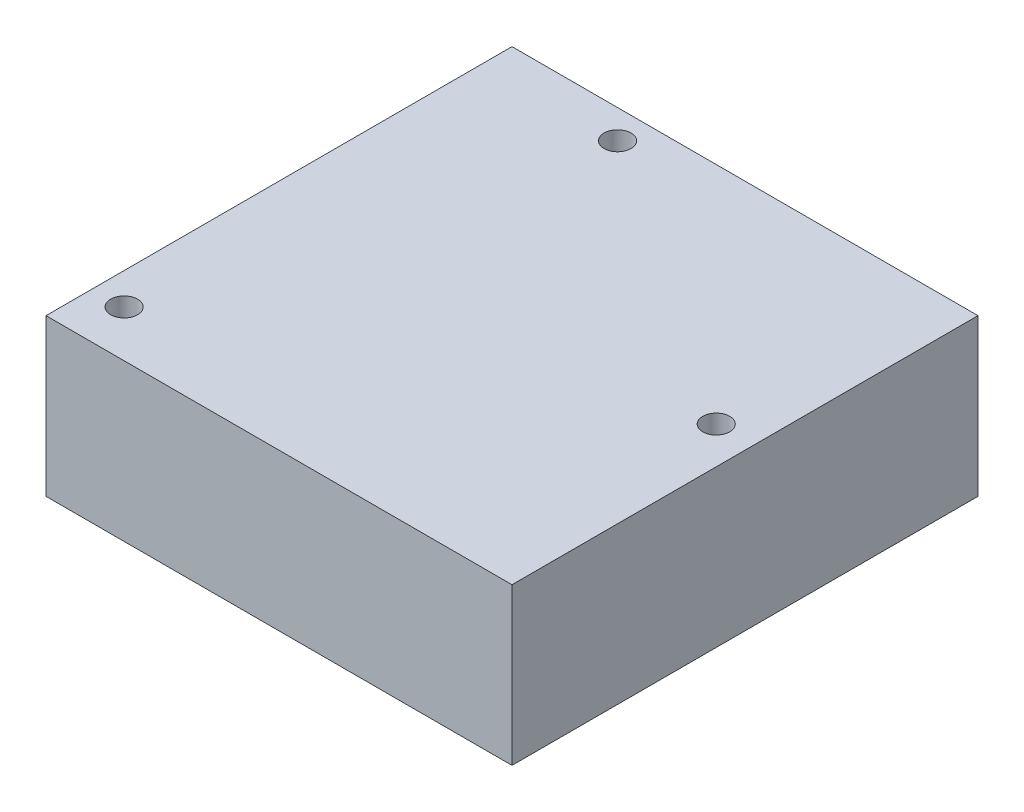
ISO-10303-21;
HEADER;
FILE_DESCRIPTION(('STEP AP214'),'2;1');
FILE_NAME('part.step','',(''),(''),'','','');
FILE_SCHEMA(('AUTOMOTIVE_DESIGN { 1 0 10303 214 1 1 1 1 }'));
ENDSEC;
DATA;
#1=APPLICATION_CONTEXT('core data for automotive mechanical design processes');
#2=APPLICATION_PROTOCOL_DEFINITION('international standard','automotive_design',2000,#1);
#3=PRODUCT_CONTEXT('',#1,'mechanical');
#4=PRODUCT('Part','Part','',(#3));
#5=PRODUCT_RELATED_PRODUCT_CATEGORY('part','',(#4));
#6=PRODUCT_DEFINITION_FORMATION('','',#4);
#7=PRODUCT_DEFINITION_CONTEXT('part definition',#1,'design');
#8=PRODUCT_DEFINITION('design','',#6,#7);
#9=PRODUCT_DEFINITION_SHAPE('','',#8);
#10=(LENGTH_UNIT() NAMED_UNIT(*) SI_UNIT(.MILLI.,.METRE.));
#11=(NAMED_UNIT(*) PLANE_ANGLE_UNIT() SI_UNIT($,.RADIAN.));
#12=(NAMED_UNIT(*) SI_UNIT($,.STERADIAN.) SOLID_ANGLE_UNIT());
#13=UNCERTAINTY_MEASURE_WITH_UNIT(LENGTH_MEASURE(1.E-05),#10,'distance_accuracy_value','');
#14=(GEOMETRIC_REPRESENTATION_CONTEXT(3) GLOBAL_UNCERTAINTY_ASSIGNED_CONTEXT((#13)) GLOBAL_UNIT_ASSIGNED_CONTEXT((#10,
#11,#12)) REPRESENTATION_CONTEXT('',''));
#15=CARTESIAN_POINT('',(0.,0.,0.));
#16=DIRECTION('',(0.,0.,1.));
#17=DIRECTION('',(1.,0.,0.));
#18=AXIS2_PLACEMENT_3D('',#15,#16,#17);
#19=CARTESIAN_POINT('',(21.59,15.,-21.59));
#20=DIRECTION('',(0.,0.,1.));
#21=DIRECTION('',(1.,0.,0.));
#22=AXIS2_PLACEMENT_3D('',#19,#20,#21);
#23=PLANE('',#22);
#24=DIRECTION('',(0.,-1.,0.));
#25=VECTOR('',#24,1.);
#26=CARTESIAN_POINT('',(21.59,15.,-21.59));
#27=LINE('',#26,#25);
#28=CARTESIAN_POINT('',(21.59,15.,-21.59));
#29=VERTEX_POINT('',#28);
#30=CARTESIAN_POINT('',(21.59,0.5,-21.59));
#31=VERTEX_POINT('',#30);
#32=EDGE_CURVE('E162',#29,#31,#27,.T.);
#33=ORIENTED_EDGE('',*,*,#32,.T.);
#34=DIRECTION('',(-1.,0.,0.));
#35=VECTOR('',#34,1.);
#36=CARTESIAN_POINT('',(21.59,0.5,-21.59));
#37=LINE('',#36,#35);
#38=CARTESIAN_POINT('',(-21.59,0.5,-21.59));
#39=VERTEX_POINT('',#38);
#40=EDGE_CURVE('E11',#31,#39,#37,.T.);
#41=ORIENTED_EDGE('',*,*,#40,.T.);
#42=DIRECTION('',(0.,-1.,0.));
#43=VECTOR('',#42,1.);
#44=CARTESIAN_POINT('',(-21.59,15.,-21.59));
#45=LINE('',#44,#43);
#46=CARTESIAN_POINT('',(-21.59,15.,-21.59));
#47=VERTEX_POINT('',#46);
#48=EDGE_CURVE('E91',#47,#39,#45,.T.);
#49=ORIENTED_EDGE('',*,*,#48,.F.);
#50=DIRECTION('',(-1.,0.,0.));
#51=VECTOR('',#50,1.);
#52=CARTESIAN_POINT('',(21.59,15.,-21.59));
#53=LINE('',#52,#51);
#54=EDGE_CURVE('E99',#29,#47,#53,.T.);
#55=ORIENTED_EDGE('',*,*,#54,.F.);
#56=EDGE_LOOP('',(#33,#41,#49,#55));
#57=FACE_BOUND('',#56,.T.);
#58=ADVANCED_FACE('F35',(#57),#23,.F.);
#59=CARTESIAN_POINT('',(-21.59,15.,-21.59));
#60=DIRECTION('',(1.,0.,0.));
#61=DIRECTION('',(0.,0.,-1.));
#62=AXIS2_PLACEMENT_3D('',#59,#60,#61);
#63=PLANE('',#62);
#64=ORIENTED_EDGE('',*,*,#48,.T.);
#65=DIRECTION('',(0.,0.,1.));
#66=VECTOR('',#65,1.);
#67=CARTESIAN_POINT('',(-21.59,0.5,-21.59));
#68=LINE('',#67,#66);
#69=CARTESIAN_POINT('',(-21.59,0.5,21.59));
#70=VERTEX_POINT('',#69);
#71=EDGE_CURVE('E125',#39,#70,#68,.T.);
#72=ORIENTED_EDGE('',*,*,#71,.T.);
#73=DIRECTION('',(0.,-1.,0.));
#74=VECTOR('',#73,1.);
#75=CARTESIAN_POINT('',(-21.59,15.,21.59));
#76=LINE('',#75,#74);
#77=CARTESIAN_POINT('',(-21.59,15.,21.59));
#78=VERTEX_POINT('',#77);
#79=EDGE_CURVE('E94',#78,#70,#76,.T.);
#80=ORIENTED_EDGE('',*,*,#79,.F.);
#81=DIRECTION('',(0.,0.,1.));
#82=VECTOR('',#81,1.);
#83=CARTESIAN_POINT('',(-21.59,15.,-21.59));
#84=LINE('',#83,#82);
#85=EDGE_CURVE('E88',#47,#78,#84,.T.);
#86=ORIENTED_EDGE('',*,*,#85,.F.);
#87=EDGE_LOOP('',(#64,#72,#80,#86));
#88=FACE_BOUND('',#87,.T.);
#89=ADVANCED_FACE('F90',(#88),#63,.F.);
#90=CARTESIAN_POINT('',(21.59,15.,21.59));
#91=DIRECTION('',(0.,0.,1.));
#92=DIRECTION('',(1.,0.,0.));
#93=AXIS2_PLACEMENT_3D('',#90,#91,#92);
#94=PLANE('',#93);
#95=ORIENTED_EDGE('',*,*,#79,.T.);
#96=DIRECTION('',(1.,0.,0.));
#97=VECTOR('',#96,1.);
#98=CARTESIAN_POINT('',(21.59,0.5,21.59));
#99=LINE('',#98,#97);
#100=CARTESIAN_POINT('',(21.59,0.5,21.59));
#101=VERTEX_POINT('',#100);
#102=EDGE_CURVE('E122',#70,#101,#99,.T.);
#103=ORIENTED_EDGE('',*,*,#102,.T.);
#104=DIRECTION('',(0.,-1.,0.));
#105=VECTOR('',#104,1.);
#106=CARTESIAN_POINT('',(21.59,15.,21.59));
#107=LINE('',#106,#105);
#108=CARTESIAN_POINT('',(21.59,15.,21.59));
#109=VERTEX_POINT('',#108);
#110=EDGE_CURVE('E112',#109,#101,#107,.T.);
#111=ORIENTED_EDGE('',*,*,#110,.F.);
#112=DIRECTION('',(-1.,0.,0.));
#113=VECTOR('',#112,1.);
#114=CARTESIAN_POINT('',(21.59,15.,21.59));
#115=LINE('',#114,#113);
#116=EDGE_CURVE('E98',#109,#78,#115,.T.);
#117=ORIENTED_EDGE('',*,*,#116,.T.);
#118=EDGE_LOOP('',(#95,#103,#111,#117));
#119=FACE_BOUND('',#118,.T.);
#120=ADVANCED_FACE('F165',(#119),#94,.T.);
#121=CARTESIAN_POINT('',(21.59,15.,-21.59));
#122=DIRECTION('',(1.,0.,0.));
#123=DIRECTION('',(0.,0.,-1.));
#124=AXIS2_PLACEMENT_3D('',#121,#122,#123);
#125=PLANE('',#124);
#126=ORIENTED_EDGE('',*,*,#110,.T.);
#127=DIRECTION('',(0.,0.,-1.));
#128=VECTOR('',#127,1.);
#129=CARTESIAN_POINT('',(21.59,0.5,-21.59));
#130=LINE('',#129,#128);
#131=EDGE_CURVE('E44',#101,#31,#130,.T.);
#132=ORIENTED_EDGE('',*,*,#131,.T.);
#133=ORIENTED_EDGE('',*,*,#32,.F.);
#134=DIRECTION('',(0.,0.,1.));
#135=VECTOR('',#134,1.);
#136=CARTESIAN_POINT('',(21.59,15.,-21.59));
#137=LINE('',#136,#135);
#138=EDGE_CURVE('E105',#29,#109,#137,.T.);
#139=ORIENTED_EDGE('',*,*,#138,.T.);
#140=EDGE_LOOP('',(#126,#132,#133,#139));
#141=FACE_BOUND('',#140,.T.);
#142=ADVANCED_FACE('F163',(#141),#125,.T.);
#143=CARTESIAN_POINT('',(0.,15.,0.));
#144=DIRECTION('',(0.,1.,0.));
#145=DIRECTION('',(0.,0.,1.));
#146=AXIS2_PLACEMENT_3D('',#143,#144,#145);
#147=PLANE('',#146);
#148=CARTESIAN_POINT('',(-18.669,15.,17.272));
#149=DIRECTION('',(0.,1.,0.));
#150=DIRECTION('',(0.,0.,1.));
#151=AXIS2_PLACEMENT_3D('',#148,#149,#150);
#152=CIRCLE('',#151,1.25);
#153=CARTESIAN_POINT('',(-18.669,15.,18.522));
#154=VERTEX_POINT('',#153);
#155=EDGE_CURVE('E137',#154,#154,#152,.T.);
#156=ORIENTED_EDGE('',*,*,#155,.F.);
#157=EDGE_LOOP('',(#156));
#158=FACE_BOUND('',#157,.T.);
#159=CARTESIAN_POINT('',(-9.144,15.,-18.923));
#160=DIRECTION('',(0.,1.,0.));
#161=DIRECTION('',(0.,0.,1.));
#162=AXIS2_PLACEMENT_3D('',#159,#160,#161);
#163=CIRCLE('',#162,1.25);
#164=CARTESIAN_POINT('',(-9.144,15.,-17.673));
#165=VERTEX_POINT('',#164);
#166=EDGE_CURVE('E147',#165,#165,#163,.T.);
#167=ORIENTED_EDGE('',*,*,#166,.F.);
#168=EDGE_LOOP('',(#167));
#169=FACE_BOUND('',#168,.T.);
#170=CARTESIAN_POINT('',(18.161,15.,-0.762000000000002));
#171=DIRECTION('',(0.,1.,0.));
#172=DIRECTION('',(0.,0.,1.));
#173=AXIS2_PLACEMENT_3D('',#170,#171,#172);
#174=CIRCLE('',#173,1.25);
#175=CARTESIAN_POINT('',(18.161,15.,0.487999999999995));
#176=VERTEX_POINT('',#175);
#177=EDGE_CURVE('E155',#176,#176,#174,.T.);
#178=ORIENTED_EDGE('',*,*,#177,.F.);
#179=EDGE_LOOP('',(#178));
#180=FACE_BOUND('',#179,.T.);
#181=ORIENTED_EDGE('',*,*,#54,.T.);
#182=ORIENTED_EDGE('',*,*,#85,.T.);
#183=ORIENTED_EDGE('',*,*,#116,.F.);
#184=ORIENTED_EDGE('',*,*,#138,.F.);
#185=EDGE_LOOP('',(#181,#182,#183,#184));
#186=FACE_BOUND('',#185,.T.);
#187=ADVANCED_FACE('F103',(#158,#169,#180,#186),#147,.T.);
#188=CARTESIAN_POINT('',(0.,0.,0.));
#189=DIRECTION('',(0.,1.,0.));
#190=DIRECTION('',(0.,0.,1.));
#191=AXIS2_PLACEMENT_3D('',#188,#189,#190);
#192=PLANE('',#191);
#193=DIRECTION('',(0.,0.,1.));
#194=VECTOR('',#193,1.);
#195=CARTESIAN_POINT('',(21.09,0.,21.59));
#196=LINE('',#195,#194);
#197=CARTESIAN_POINT('',(21.09,0.,-21.09));
#198=VERTEX_POINT('',#197);
#199=CARTESIAN_POINT('',(21.09,0.,21.09));
#200=VERTEX_POINT('',#199);
#201=EDGE_CURVE('E110',#198,#200,#196,.T.);
#202=ORIENTED_EDGE('',*,*,#201,.T.);
#203=DIRECTION('',(-1.,0.,0.));
#204=VECTOR('',#203,1.);
#205=CARTESIAN_POINT('',(-21.59,0.,21.09));
#206=LINE('',#205,#204);
#207=CARTESIAN_POINT('',(-21.09,0.,21.09));
#208=VERTEX_POINT('',#207);
#209=EDGE_CURVE('E119',#200,#208,#206,.T.);
#210=ORIENTED_EDGE('',*,*,#209,.T.);
#211=DIRECTION('',(0.,0.,-1.));
#212=VECTOR('',#211,1.);
#213=CARTESIAN_POINT('',(-21.09,0.,0.));
#214=LINE('',#213,#212);
#215=CARTESIAN_POINT('',(-21.09,0.,-21.09));
#216=VERTEX_POINT('',#215);
#217=EDGE_CURVE('E117',#208,#216,#214,.T.);
#218=ORIENTED_EDGE('',*,*,#217,.T.);
#219=DIRECTION('',(1.,0.,0.));
#220=VECTOR('',#219,1.);
#221=CARTESIAN_POINT('',(0.,0.,-21.09));
#222=LINE('',#221,#220);
#223=EDGE_CURVE('E108',#216,#198,#222,.T.);
#224=ORIENTED_EDGE('',*,*,#223,.T.);
#225=EDGE_LOOP('',(#202,#210,#218,#224));
#226=FACE_BOUND('',#225,.T.);
#227=CARTESIAN_POINT('',(-18.669,0.,17.272));
#228=DIRECTION('',(0.,1.,0.));
#229=DIRECTION('',(0.,0.,1.));
#230=AXIS2_PLACEMENT_3D('',#227,#228,#229);
#231=CIRCLE('',#230,1.25);
#232=CARTESIAN_POINT('',(-18.669,0.,18.522));
#233=VERTEX_POINT('',#232);
#234=EDGE_CURVE('E142',#233,#233,#231,.T.);
#235=ORIENTED_EDGE('',*,*,#234,.T.);
#236=EDGE_LOOP('',(#235));
#237=FACE_BOUND('',#236,.T.);
#238=CARTESIAN_POINT('',(-9.144,0.,-18.923));
#239=DIRECTION('',(0.,1.,0.));
#240=DIRECTION('',(0.,0.,1.));
#241=AXIS2_PLACEMENT_3D('',#238,#239,#240);
#242=CIRCLE('',#241,1.25);
#243=CARTESIAN_POINT('',(-9.144,0.,-17.673));
#244=VERTEX_POINT('',#243);
#245=EDGE_CURVE('E152',#244,#244,#242,.T.);
#246=ORIENTED_EDGE('',*,*,#245,.T.);
#247=EDGE_LOOP('',(#246));
#248=FACE_BOUND('',#247,.T.);
#249=CARTESIAN_POINT('',(18.161,0.,-0.762000000000002));
#250=DIRECTION('',(0.,1.,0.));
#251=DIRECTION('',(0.,0.,1.));
#252=AXIS2_PLACEMENT_3D('',#249,#250,#251);
#253=CIRCLE('',#252,1.25);
#254=CARTESIAN_POINT('',(18.161,0.,0.487999999999995));
#255=VERTEX_POINT('',#254);
#256=EDGE_CURVE('E106',#255,#255,#253,.T.);
#257=ORIENTED_EDGE('',*,*,#256,.T.);
#258=EDGE_LOOP('',(#257));
#259=FACE_BOUND('',#258,.T.);
#260=ADVANCED_FACE('F175',(#226,#237,#248,#259),#192,.F.);
#261=CARTESIAN_POINT('',(18.161,15.,-0.762000000000002));
#262=DIRECTION('',(0.,1.,0.));
#263=DIRECTION('',(0.,0.,1.));
#264=AXIS2_PLACEMENT_3D('',#261,#262,#263);
#265=CYLINDRICAL_SURFACE('',#264,1.25);
#266=ORIENTED_EDGE('',*,*,#256,.F.);
#267=EDGE_LOOP('',(#266));
#268=FACE_BOUND('',#267,.T.);
#269=ORIENTED_EDGE('',*,*,#177,.T.);
#270=EDGE_LOOP('',(#269));
#271=FACE_BOUND('',#270,.T.);
#272=ADVANCED_FACE('F222',(#268,#271),#265,.F.);
#273=CARTESIAN_POINT('',(-9.144,15.,-18.923));
#274=DIRECTION('',(0.,1.,0.));
#275=DIRECTION('',(0.,0.,1.));
#276=AXIS2_PLACEMENT_3D('',#273,#274,#275);
#277=CYLINDRICAL_SURFACE('',#276,1.25);
#278=ORIENTED_EDGE('',*,*,#245,.F.);
#279=EDGE_LOOP('',(#278));
#280=FACE_BOUND('',#279,.T.);
#281=ORIENTED_EDGE('',*,*,#166,.T.);
#282=EDGE_LOOP('',(#281));
#283=FACE_BOUND('',#282,.T.);
#284=ADVANCED_FACE('F259',(#280,#283),#277,.F.);
#285=CARTESIAN_POINT('',(-18.669,15.,17.272));
#286=DIRECTION('',(0.,1.,0.));
#287=DIRECTION('',(0.,0.,1.));
#288=AXIS2_PLACEMENT_3D('',#285,#286,#287);
#289=CYLINDRICAL_SURFACE('',#288,1.25);
#290=ORIENTED_EDGE('',*,*,#234,.F.);
#291=EDGE_LOOP('',(#290));
#292=FACE_BOUND('',#291,.T.);
#293=ORIENTED_EDGE('',*,*,#155,.T.);
#294=EDGE_LOOP('',(#293));
#295=FACE_BOUND('',#294,.T.);
#296=ADVANCED_FACE('F184',(#292,#295),#289,.F.);
#297=CARTESIAN_POINT('',(21.59,0.5,-21.59));
#298=DIRECTION('',(0.,0.707106781186546,0.707106781186549));
#299=DIRECTION('',(-1.,0.,0.));
#300=AXIS2_PLACEMENT_3D('',#297,#298,#299);
#301=PLANE('',#300);
#302=DIRECTION('',(-0.577350269189627,0.577350269189627,-0.577350269189624));
#303=VECTOR('',#302,1.);
#304=CARTESIAN_POINT('',(-7.19666666666663,-13.8933333333334,-7.19666666666668));
#305=LINE('',#304,#303);
#306=EDGE_CURVE('E131',#39,#216,#305,.F.);
#307=ORIENTED_EDGE('',*,*,#306,.F.);
#308=ORIENTED_EDGE('',*,*,#40,.F.);
#309=DIRECTION('',(0.577350269189626,0.577350269189626,-0.577350269189625));
#310=VECTOR('',#309,1.);
#311=CARTESIAN_POINT('',(21.59,0.5,-21.59));
#312=LINE('',#311,#310);
#313=EDGE_CURVE('E39',#198,#31,#312,.T.);
#314=ORIENTED_EDGE('',*,*,#313,.F.);
#315=ORIENTED_EDGE('',*,*,#223,.F.);
#316=EDGE_LOOP('',(#307,#308,#314,#315));
#317=FACE_BOUND('',#316,.T.);
#318=ADVANCED_FACE('F37',(#317),#301,.F.);
#319=CARTESIAN_POINT('',(21.09,0.,0.));
#320=DIRECTION('',(0.707106781186547,-0.707106781186547,0.));
#321=DIRECTION('',(0.,0.,-1.));
#322=AXIS2_PLACEMENT_3D('',#319,#320,#321);
#323=PLANE('',#322);
#324=ORIENTED_EDGE('',*,*,#313,.T.);
#325=ORIENTED_EDGE('',*,*,#131,.F.);
#326=DIRECTION('',(-0.577350269189626,-0.577350269189626,-0.577350269189626));
#327=VECTOR('',#326,1.);
#328=CARTESIAN_POINT('',(14.06,-7.03,14.06));
#329=LINE('',#328,#327);
#330=EDGE_CURVE('E130',#200,#101,#329,.F.);
#331=ORIENTED_EDGE('',*,*,#330,.F.);
#332=ORIENTED_EDGE('',*,*,#201,.F.);
#333=EDGE_LOOP('',(#324,#325,#331,#332));
#334=FACE_BOUND('',#333,.T.);
#335=ADVANCED_FACE('F177',(#334),#323,.T.);
#336=CARTESIAN_POINT('',(-21.59,0.5,-21.59));
#337=DIRECTION('',(0.707106781186547,0.707106781186547,0.));
#338=DIRECTION('',(0.,0.,1.));
#339=AXIS2_PLACEMENT_3D('',#336,#337,#338);
#340=PLANE('',#339);
#341=ORIENTED_EDGE('',*,*,#306,.T.);
#342=ORIENTED_EDGE('',*,*,#217,.F.);
#343=DIRECTION('',(0.577350269189626,-0.577350269189626,-0.577350269189626));
#344=VECTOR('',#343,1.);
#345=CARTESIAN_POINT('',(-7.19666666666666,-13.8933333333333,7.19666666666667));
#346=LINE('',#345,#344);
#347=EDGE_CURVE('E128',#70,#208,#346,.T.);
#348=ORIENTED_EDGE('',*,*,#347,.F.);
#349=ORIENTED_EDGE('',*,*,#71,.F.);
#350=EDGE_LOOP('',(#341,#342,#348,#349));
#351=FACE_BOUND('',#350,.T.);
#352=ADVANCED_FACE('F172',(#351),#340,.F.);
#353=CARTESIAN_POINT('',(0.,0.,21.09));
#354=DIRECTION('',(0.,-0.707106781186547,0.707106781186547));
#355=DIRECTION('',(1.,0.,0.));
#356=AXIS2_PLACEMENT_3D('',#353,#354,#355);
#357=PLANE('',#356);
#358=ORIENTED_EDGE('',*,*,#330,.T.);
#359=ORIENTED_EDGE('',*,*,#102,.F.);
#360=ORIENTED_EDGE('',*,*,#347,.T.);
#361=ORIENTED_EDGE('',*,*,#209,.F.);
#362=EDGE_LOOP('',(#358,#359,#360,#361));
#363=FACE_BOUND('',#362,.T.);
#364=ADVANCED_FACE('F169',(#363),#357,.T.);
#365=CLOSED_SHELL('',(#58,#89,#120,#142,#187,#260,#272,#284,#296,#318,#335,#352,#364));
#366=MANIFOLD_SOLID_BREP('B2',#365);
#367=ADVANCED_BREP_SHAPE_REPRESENTATION('',(#18,#366),#14);
#368=SHAPE_DEFINITION_REPRESENTATION(#9,#367);
ENDSEC;
END-ISO-10303-21;
